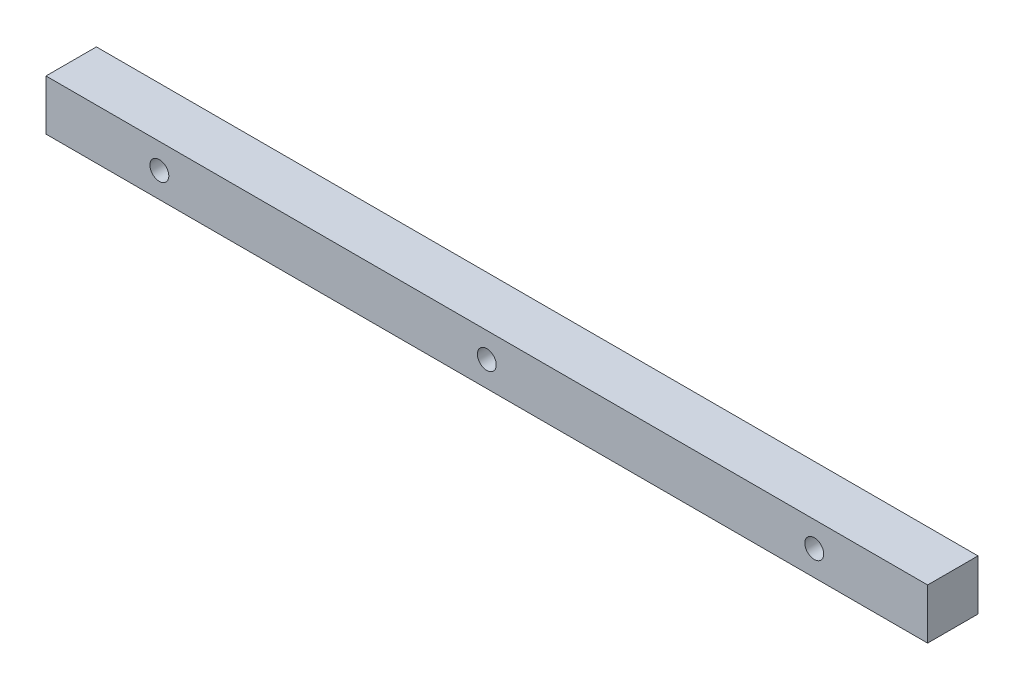
ISO-10303-21;
HEADER;
FILE_DESCRIPTION(('STEP AP214'),'2;1');
FILE_NAME('part.step','',(''),(''),'','','');
FILE_SCHEMA(('AUTOMOTIVE_DESIGN { 1 0 10303 214 1 1 1 1 }'));
ENDSEC;
DATA;
#1=APPLICATION_CONTEXT('core data for automotive mechanical design processes');
#2=APPLICATION_PROTOCOL_DEFINITION('international standard','automotive_design',2000,#1);
#3=PRODUCT_CONTEXT('',#1,'mechanical');
#4=PRODUCT('Part','Part','',(#3));
#5=PRODUCT_RELATED_PRODUCT_CATEGORY('part','',(#4));
#6=PRODUCT_DEFINITION_FORMATION('','',#4);
#7=PRODUCT_DEFINITION_CONTEXT('part definition',#1,'design');
#8=PRODUCT_DEFINITION('design','',#6,#7);
#9=PRODUCT_DEFINITION_SHAPE('','',#8);
#10=(LENGTH_UNIT() NAMED_UNIT(*) SI_UNIT(.MILLI.,.METRE.));
#11=(NAMED_UNIT(*) PLANE_ANGLE_UNIT() SI_UNIT($,.RADIAN.));
#12=(NAMED_UNIT(*) SI_UNIT($,.STERADIAN.) SOLID_ANGLE_UNIT());
#13=UNCERTAINTY_MEASURE_WITH_UNIT(LENGTH_MEASURE(1.E-05),#10,'distance_accuracy_value','');
#14=(GEOMETRIC_REPRESENTATION_CONTEXT(3) GLOBAL_UNCERTAINTY_ASSIGNED_CONTEXT((#13)) GLOBAL_UNIT_ASSIGNED_CONTEXT((#10,
#11,#12)) REPRESENTATION_CONTEXT('',''));
#15=CARTESIAN_POINT('',(0.,0.,0.));
#16=DIRECTION('',(0.,0.,1.));
#17=DIRECTION('',(1.,0.,0.));
#18=AXIS2_PLACEMENT_3D('',#15,#16,#17);
#19=CARTESIAN_POINT('',(0.,0.,8.));
#20=DIRECTION('',(0.,0.,-1.));
#21=DIRECTION('',(-1.,0.,0.));
#22=AXIS2_PLACEMENT_3D('',#19,#20,#21);
#23=PLANE('',#22);
#24=CARTESIAN_POINT('',(18.,4.,8.));
#25=DIRECTION('',(0.,0.,1.));
#26=DIRECTION('',(1.,0.,0.));
#27=AXIS2_PLACEMENT_3D('',#24,#25,#26);
#28=CIRCLE('',#27,1.5);
#29=CARTESIAN_POINT('',(19.5,4.,8.));
#30=VERTEX_POINT('',#29);
#31=EDGE_CURVE('E116',#30,#30,#28,.T.);
#32=ORIENTED_EDGE('',*,*,#31,.F.);
#33=EDGE_LOOP('',(#32));
#34=FACE_BOUND('',#33,.T.);
#35=DIRECTION('',(0.,-1.,0.));
#36=VECTOR('',#35,1.);
#37=CARTESIAN_POINT('',(0.,0.,8.));
#38=LINE('',#37,#36);
#39=CARTESIAN_POINT('',(0.,8.,8.));
#40=VERTEX_POINT('',#39);
#41=CARTESIAN_POINT('',(0.,0.,8.));
#42=VERTEX_POINT('',#41);
#43=EDGE_CURVE('E86',#40,#42,#38,.T.);
#44=ORIENTED_EDGE('',*,*,#43,.T.);
#45=DIRECTION('',(1.,0.,0.));
#46=VECTOR('',#45,1.);
#47=CARTESIAN_POINT('',(0.,0.,8.));
#48=LINE('',#47,#46);
#49=CARTESIAN_POINT('',(140.,0.,8.));
#50=VERTEX_POINT('',#49);
#51=EDGE_CURVE('E81',#42,#50,#48,.T.);
#52=ORIENTED_EDGE('',*,*,#51,.T.);
#53=DIRECTION('',(0.,1.,0.));
#54=VECTOR('',#53,1.);
#55=CARTESIAN_POINT('',(140.,0.,8.));
#56=LINE('',#55,#54);
#57=CARTESIAN_POINT('',(140.,8.,8.));
#58=VERTEX_POINT('',#57);
#59=EDGE_CURVE('E84',#50,#58,#56,.T.);
#60=ORIENTED_EDGE('',*,*,#59,.T.);
#61=DIRECTION('',(-1.,0.,0.));
#62=VECTOR('',#61,1.);
#63=CARTESIAN_POINT('',(0.,8.,8.));
#64=LINE('',#63,#62);
#65=EDGE_CURVE('E51',#58,#40,#64,.T.);
#66=ORIENTED_EDGE('',*,*,#65,.T.);
#67=EDGE_LOOP('',(#44,#52,#60,#66));
#68=FACE_BOUND('',#67,.T.);
#69=CARTESIAN_POINT('',(70.,4.,8.));
#70=DIRECTION('',(0.,0.,1.));
#71=DIRECTION('',(1.,0.,0.));
#72=AXIS2_PLACEMENT_3D('',#69,#70,#71);
#73=CIRCLE('',#72,1.5);
#74=CARTESIAN_POINT('',(71.5,4.,8.));
#75=VERTEX_POINT('',#74);
#76=EDGE_CURVE('E101',#75,#75,#73,.T.);
#77=ORIENTED_EDGE('',*,*,#76,.F.);
#78=EDGE_LOOP('',(#77));
#79=FACE_BOUND('',#78,.T.);
#80=CARTESIAN_POINT('',(122.,4.,8.));
#81=DIRECTION('',(0.,0.,1.));
#82=DIRECTION('',(-1.,0.,0.));
#83=AXIS2_PLACEMENT_3D('',#80,#81,#82);
#84=CIRCLE('',#83,1.5);
#85=CARTESIAN_POINT('',(120.5,4.,8.));
#86=VERTEX_POINT('',#85);
#87=EDGE_CURVE('E122',#86,#86,#84,.T.);
#88=ORIENTED_EDGE('',*,*,#87,.F.);
#89=EDGE_LOOP('',(#88));
#90=FACE_BOUND('',#89,.T.);
#91=ADVANCED_FACE('F34',(#34,#68,#79,#90),#23,.F.);
#92=CARTESIAN_POINT('',(0.,0.,0.));
#93=DIRECTION('',(0.,0.,-1.));
#94=DIRECTION('',(-1.,0.,0.));
#95=AXIS2_PLACEMENT_3D('',#92,#93,#94);
#96=PLANE('',#95);
#97=CARTESIAN_POINT('',(18.,4.,0.));
#98=DIRECTION('',(0.,0.,1.));
#99=DIRECTION('',(1.,0.,0.));
#100=AXIS2_PLACEMENT_3D('',#97,#98,#99);
#101=CIRCLE('',#100,1.5);
#102=CARTESIAN_POINT('',(19.5,4.,0.));
#103=VERTEX_POINT('',#102);
#104=EDGE_CURVE('E119',#103,#103,#101,.T.);
#105=ORIENTED_EDGE('',*,*,#104,.T.);
#106=EDGE_LOOP('',(#105));
#107=FACE_BOUND('',#106,.T.);
#108=DIRECTION('',(0.,-1.,0.));
#109=VECTOR('',#108,1.);
#110=CARTESIAN_POINT('',(0.,0.,0.));
#111=LINE('',#110,#109);
#112=CARTESIAN_POINT('',(0.,8.,0.));
#113=VERTEX_POINT('',#112);
#114=CARTESIAN_POINT('',(0.,0.,0.));
#115=VERTEX_POINT('',#114);
#116=EDGE_CURVE('E98',#113,#115,#111,.T.);
#117=ORIENTED_EDGE('',*,*,#116,.F.);
#118=DIRECTION('',(-1.,0.,0.));
#119=VECTOR('',#118,1.);
#120=CARTESIAN_POINT('',(0.,8.,0.));
#121=LINE('',#120,#119);
#122=CARTESIAN_POINT('',(140.,8.,0.));
#123=VERTEX_POINT('',#122);
#124=EDGE_CURVE('E74',#123,#113,#121,.T.);
#125=ORIENTED_EDGE('',*,*,#124,.F.);
#126=DIRECTION('',(0.,1.,0.));
#127=VECTOR('',#126,1.);
#128=CARTESIAN_POINT('',(140.,0.,0.));
#129=LINE('',#128,#127);
#130=CARTESIAN_POINT('',(140.,0.,0.));
#131=VERTEX_POINT('',#130);
#132=EDGE_CURVE('E68',#131,#123,#129,.T.);
#133=ORIENTED_EDGE('',*,*,#132,.F.);
#134=DIRECTION('',(1.,0.,0.));
#135=VECTOR('',#134,1.);
#136=CARTESIAN_POINT('',(0.,0.,0.));
#137=LINE('',#136,#135);
#138=EDGE_CURVE('E90',#115,#131,#137,.T.);
#139=ORIENTED_EDGE('',*,*,#138,.F.);
#140=EDGE_LOOP('',(#117,#125,#133,#139));
#141=FACE_BOUND('',#140,.T.);
#142=CARTESIAN_POINT('',(70.,4.,0.));
#143=DIRECTION('',(0.,0.,1.));
#144=DIRECTION('',(1.,0.,0.));
#145=AXIS2_PLACEMENT_3D('',#142,#143,#144);
#146=CIRCLE('',#145,1.5);
#147=CARTESIAN_POINT('',(71.5,4.,0.));
#148=VERTEX_POINT('',#147);
#149=EDGE_CURVE('E113',#148,#148,#146,.T.);
#150=ORIENTED_EDGE('',*,*,#149,.T.);
#151=EDGE_LOOP('',(#150));
#152=FACE_BOUND('',#151,.T.);
#153=CARTESIAN_POINT('',(122.,4.,0.));
#154=DIRECTION('',(0.,0.,1.));
#155=DIRECTION('',(-1.,0.,0.));
#156=AXIS2_PLACEMENT_3D('',#153,#154,#155);
#157=CIRCLE('',#156,1.5);
#158=CARTESIAN_POINT('',(120.5,4.,0.));
#159=VERTEX_POINT('',#158);
#160=EDGE_CURVE('E125',#159,#159,#157,.T.);
#161=ORIENTED_EDGE('',*,*,#160,.T.);
#162=EDGE_LOOP('',(#161));
#163=FACE_BOUND('',#162,.T.);
#164=ADVANCED_FACE('F109',(#107,#141,#152,#163),#96,.T.);
#165=CARTESIAN_POINT('',(0.,0.,8.));
#166=DIRECTION('',(1.,0.,0.));
#167=DIRECTION('',(0.,0.,-1.));
#168=AXIS2_PLACEMENT_3D('',#165,#166,#167);
#169=PLANE('',#168);
#170=ORIENTED_EDGE('',*,*,#116,.T.);
#171=DIRECTION('',(0.,0.,-1.));
#172=VECTOR('',#171,1.);
#173=CARTESIAN_POINT('',(0.,0.,8.));
#174=LINE('',#173,#172);
#175=EDGE_CURVE('E11',#42,#115,#174,.T.);
#176=ORIENTED_EDGE('',*,*,#175,.F.);
#177=ORIENTED_EDGE('',*,*,#43,.F.);
#178=DIRECTION('',(0.,0.,-1.));
#179=VECTOR('',#178,1.);
#180=CARTESIAN_POINT('',(0.,8.,8.));
#181=LINE('',#180,#179);
#182=EDGE_CURVE('E94',#40,#113,#181,.T.);
#183=ORIENTED_EDGE('',*,*,#182,.T.);
#184=EDGE_LOOP('',(#170,#176,#177,#183));
#185=FACE_BOUND('',#184,.T.);
#186=ADVANCED_FACE('F36',(#185),#169,.F.);
#187=CARTESIAN_POINT('',(0.,0.,8.));
#188=DIRECTION('',(0.,1.,0.));
#189=DIRECTION('',(0.,0.,1.));
#190=AXIS2_PLACEMENT_3D('',#187,#188,#189);
#191=PLANE('',#190);
#192=ORIENTED_EDGE('',*,*,#138,.T.);
#193=DIRECTION('',(0.,0.,-1.));
#194=VECTOR('',#193,1.);
#195=CARTESIAN_POINT('',(140.,0.,8.));
#196=LINE('',#195,#194);
#197=EDGE_CURVE('E43',#50,#131,#196,.T.);
#198=ORIENTED_EDGE('',*,*,#197,.F.);
#199=ORIENTED_EDGE('',*,*,#51,.F.);
#200=ORIENTED_EDGE('',*,*,#175,.T.);
#201=EDGE_LOOP('',(#192,#198,#199,#200));
#202=FACE_BOUND('',#201,.T.);
#203=ADVANCED_FACE('F89',(#202),#191,.F.);
#204=CARTESIAN_POINT('',(140.,0.,8.));
#205=DIRECTION('',(-1.,0.,0.));
#206=DIRECTION('',(0.,0.,1.));
#207=AXIS2_PLACEMENT_3D('',#204,#205,#206);
#208=PLANE('',#207);
#209=ORIENTED_EDGE('',*,*,#132,.T.);
#210=DIRECTION('',(0.,0.,-1.));
#211=VECTOR('',#210,1.);
#212=CARTESIAN_POINT('',(140.,8.,8.));
#213=LINE('',#212,#211);
#214=EDGE_CURVE('E91',#58,#123,#213,.T.);
#215=ORIENTED_EDGE('',*,*,#214,.F.);
#216=ORIENTED_EDGE('',*,*,#59,.F.);
#217=ORIENTED_EDGE('',*,*,#197,.T.);
#218=EDGE_LOOP('',(#209,#215,#216,#217));
#219=FACE_BOUND('',#218,.T.);
#220=ADVANCED_FACE('F92',(#219),#208,.F.);
#221=CARTESIAN_POINT('',(0.,8.,8.));
#222=DIRECTION('',(0.,-1.,0.));
#223=DIRECTION('',(0.,0.,-1.));
#224=AXIS2_PLACEMENT_3D('',#221,#222,#223);
#225=PLANE('',#224);
#226=ORIENTED_EDGE('',*,*,#124,.T.);
#227=ORIENTED_EDGE('',*,*,#182,.F.);
#228=ORIENTED_EDGE('',*,*,#65,.F.);
#229=ORIENTED_EDGE('',*,*,#214,.T.);
#230=EDGE_LOOP('',(#226,#227,#228,#229));
#231=FACE_BOUND('',#230,.T.);
#232=ADVANCED_FACE('F106',(#231),#225,.F.);
#233=CARTESIAN_POINT('',(70.,4.,8.));
#234=DIRECTION('',(0.,0.,-1.));
#235=DIRECTION('',(-1.,0.,0.));
#236=AXIS2_PLACEMENT_3D('',#233,#234,#235);
#237=CYLINDRICAL_SURFACE('',#236,1.5);
#238=ORIENTED_EDGE('',*,*,#76,.T.);
#239=EDGE_LOOP('',(#238));
#240=FACE_BOUND('',#239,.T.);
#241=ORIENTED_EDGE('',*,*,#149,.F.);
#242=EDGE_LOOP('',(#241));
#243=FACE_BOUND('',#242,.T.);
#244=ADVANCED_FACE('F144',(#240,#243),#237,.F.);
#245=CARTESIAN_POINT('',(18.,4.,8.));
#246=DIRECTION('',(0.,0.,-1.));
#247=DIRECTION('',(-1.,0.,0.));
#248=AXIS2_PLACEMENT_3D('',#245,#246,#247);
#249=CYLINDRICAL_SURFACE('',#248,1.5);
#250=ORIENTED_EDGE('',*,*,#31,.T.);
#251=EDGE_LOOP('',(#250));
#252=FACE_BOUND('',#251,.T.);
#253=ORIENTED_EDGE('',*,*,#104,.F.);
#254=EDGE_LOOP('',(#253));
#255=FACE_BOUND('',#254,.T.);
#256=ADVANCED_FACE('F190',(#252,#255),#249,.F.);
#257=CARTESIAN_POINT('',(122.,4.,8.));
#258=DIRECTION('',(0.,0.,-1.));
#259=DIRECTION('',(-1.,0.,0.));
#260=AXIS2_PLACEMENT_3D('',#257,#258,#259);
#261=CYLINDRICAL_SURFACE('',#260,1.5);
#262=ORIENTED_EDGE('',*,*,#87,.T.);
#263=EDGE_LOOP('',(#262));
#264=FACE_BOUND('',#263,.T.);
#265=ORIENTED_EDGE('',*,*,#160,.F.);
#266=EDGE_LOOP('',(#265));
#267=FACE_BOUND('',#266,.T.);
#268=ADVANCED_FACE('F131',(#264,#267),#261,.F.);
#269=CLOSED_SHELL('',(#91,#164,#186,#203,#220,#232,#244,#256,#268));
#270=MANIFOLD_SOLID_BREP('B2',#269);
#271=ADVANCED_BREP_SHAPE_REPRESENTATION('',(#18,#270),#14);
#272=SHAPE_DEFINITION_REPRESENTATION(#9,#271);
ENDSEC;
END-ISO-10303-21;
